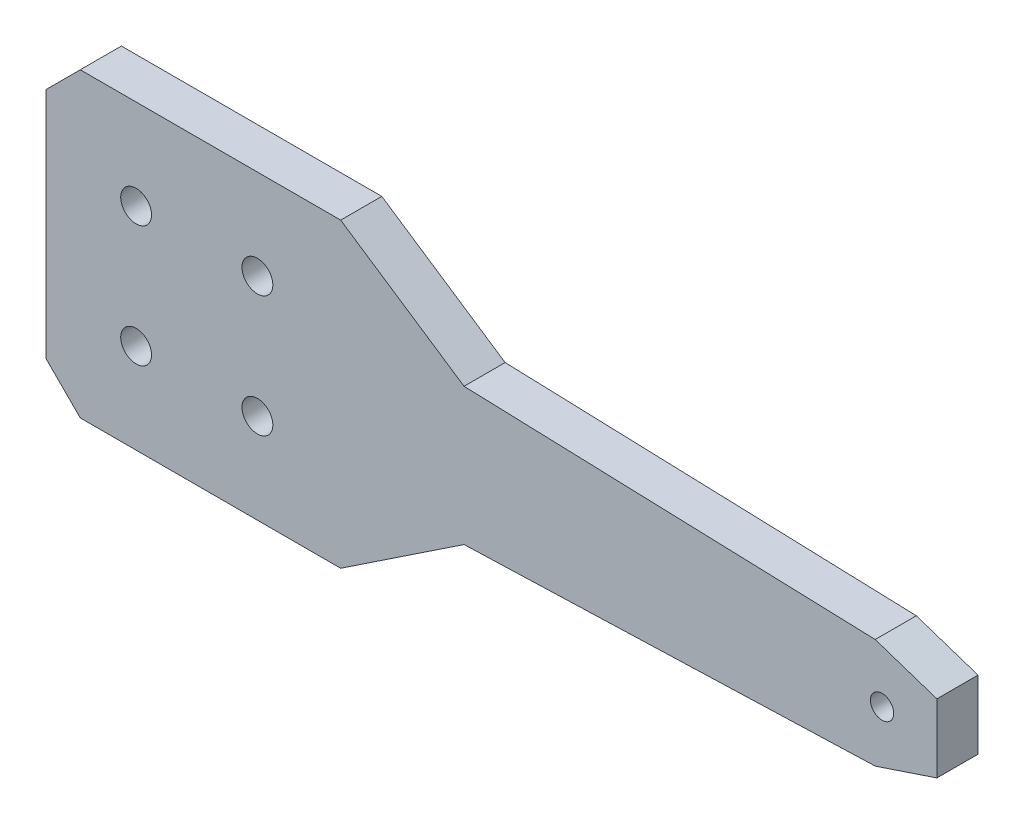
ISO-10303-21;
HEADER;
FILE_DESCRIPTION(('STEP AP214'),'2;1');
FILE_NAME('part.step','',(''),(''),'','','');
FILE_SCHEMA(('AUTOMOTIVE_DESIGN { 1 0 10303 214 1 1 1 1 }'));
ENDSEC;
DATA;
#1=APPLICATION_CONTEXT('core data for automotive mechanical design processes');
#2=APPLICATION_PROTOCOL_DEFINITION('international standard','automotive_design',2000,#1);
#3=PRODUCT_CONTEXT('',#1,'mechanical');
#4=PRODUCT('Part','Part','',(#3));
#5=PRODUCT_RELATED_PRODUCT_CATEGORY('part','',(#4));
#6=PRODUCT_DEFINITION_FORMATION('','',#4);
#7=PRODUCT_DEFINITION_CONTEXT('part definition',#1,'design');
#8=PRODUCT_DEFINITION('design','',#6,#7);
#9=PRODUCT_DEFINITION_SHAPE('','',#8);
#10=(LENGTH_UNIT() NAMED_UNIT(*) SI_UNIT(.MILLI.,.METRE.));
#11=(NAMED_UNIT(*) PLANE_ANGLE_UNIT() SI_UNIT($,.RADIAN.));
#12=(NAMED_UNIT(*) SI_UNIT($,.STERADIAN.) SOLID_ANGLE_UNIT());
#13=UNCERTAINTY_MEASURE_WITH_UNIT(LENGTH_MEASURE(1.E-05),#10,'distance_accuracy_value','');
#14=(GEOMETRIC_REPRESENTATION_CONTEXT(3) GLOBAL_UNCERTAINTY_ASSIGNED_CONTEXT((#13)) GLOBAL_UNIT_ASSIGNED_CONTEXT((#10,
#11,#12)) REPRESENTATION_CONTEXT('',''));
#15=CARTESIAN_POINT('',(0.,0.,0.));
#16=DIRECTION('',(0.,0.,1.));
#17=DIRECTION('',(1.,0.,0.));
#18=AXIS2_PLACEMENT_3D('',#15,#16,#17);
#19=CARTESIAN_POINT('',(0.,0.,6.));
#20=DIRECTION('',(0.,0.,1.));
#21=DIRECTION('',(1.,0.,0.));
#22=AXIS2_PLACEMENT_3D('',#19,#20,#21);
#23=PLANE('',#22);
#24=CARTESIAN_POINT('',(8.85,8.85,6.));
#25=DIRECTION('',(0.,0.,1.));
#26=DIRECTION('',(1.,0.,0.));
#27=AXIS2_PLACEMENT_3D('',#24,#25,#26);
#28=CIRCLE('',#27,2.25);
#29=CARTESIAN_POINT('',(11.1,8.85,6.));
#30=VERTEX_POINT('',#29);
#31=EDGE_CURVE('E299',#30,#30,#28,.T.);
#32=ORIENTED_EDGE('',*,*,#31,.F.);
#33=EDGE_LOOP('',(#32));
#34=FACE_BOUND('',#33,.T.);
#35=CARTESIAN_POINT('',(-8.85,8.85,6.));
#36=DIRECTION('',(0.,0.,1.));
#37=DIRECTION('',(1.,0.,0.));
#38=AXIS2_PLACEMENT_3D('',#35,#36,#37);
#39=CIRCLE('',#38,2.25);
#40=CARTESIAN_POINT('',(-6.6,8.85,6.));
#41=VERTEX_POINT('',#40);
#42=EDGE_CURVE('E311',#41,#41,#39,.T.);
#43=ORIENTED_EDGE('',*,*,#42,.F.);
#44=EDGE_LOOP('',(#43));
#45=FACE_BOUND('',#44,.T.);
#46=DIRECTION('',(0.,-1.,0.));
#47=VECTOR('',#46,1.);
#48=CARTESIAN_POINT('',(-22.,17.,6.));
#49=LINE('',#48,#47);
#50=CARTESIAN_POINT('',(-22.,17.,6.));
#51=VERTEX_POINT('',#50);
#52=CARTESIAN_POINT('',(-22.,-17.,6.));
#53=VERTEX_POINT('',#52);
#54=EDGE_CURVE('E181',#51,#53,#49,.T.);
#55=ORIENTED_EDGE('',*,*,#54,.T.);
#56=DIRECTION('',(0.707106781186547,-0.707106781186547,0.));
#57=VECTOR('',#56,1.);
#58=CARTESIAN_POINT('',(-22.,-17.,6.));
#59=LINE('',#58,#57);
#60=CARTESIAN_POINT('',(-17.,-22.,6.));
#61=VERTEX_POINT('',#60);
#62=EDGE_CURVE('E109',#53,#61,#59,.T.);
#63=ORIENTED_EDGE('',*,*,#62,.T.);
#64=DIRECTION('',(1.,0.,0.));
#65=VECTOR('',#64,1.);
#66=CARTESIAN_POINT('',(-17.,-22.,6.));
#67=LINE('',#66,#65);
#68=CARTESIAN_POINT('',(21.,-22.,6.));
#69=VERTEX_POINT('',#68);
#70=EDGE_CURVE('E208',#61,#69,#67,.T.);
#71=ORIENTED_EDGE('',*,*,#70,.T.);
#72=DIRECTION('',(0.832050294337844,0.554700196225229,0.));
#73=VECTOR('',#72,1.);
#74=CARTESIAN_POINT('',(21.,-22.,6.));
#75=LINE('',#74,#73);
#76=CARTESIAN_POINT('',(39.,-10.,6.));
#77=VERTEX_POINT('',#76);
#78=EDGE_CURVE('E227',#69,#77,#75,.T.);
#79=ORIENTED_EDGE('',*,*,#78,.T.);
#80=DIRECTION('',(0.999444906979154,0.0333148302326385,0.));
#81=VECTOR('',#80,1.);
#82=CARTESIAN_POINT('',(39.,-10.,6.));
#83=LINE('',#82,#81);
#84=CARTESIAN_POINT('',(99.,-8.,6.));
#85=VERTEX_POINT('',#84);
#86=EDGE_CURVE('E224',#77,#85,#83,.T.);
#87=ORIENTED_EDGE('',*,*,#86,.T.);
#88=DIRECTION('',(0.948683298050514,0.316227766016838,0.));
#89=VECTOR('',#88,1.);
#90=CARTESIAN_POINT('',(99.,-8.,6.));
#91=LINE('',#90,#89);
#92=CARTESIAN_POINT('',(108.,-5.,6.));
#93=VERTEX_POINT('',#92);
#94=EDGE_CURVE('E226',#85,#93,#91,.T.);
#95=ORIENTED_EDGE('',*,*,#94,.T.);
#96=DIRECTION('',(0.,1.,0.));
#97=VECTOR('',#96,1.);
#98=CARTESIAN_POINT('',(108.,-5.,6.));
#99=LINE('',#98,#97);
#100=CARTESIAN_POINT('',(108.,5.,6.));
#101=VERTEX_POINT('',#100);
#102=EDGE_CURVE('E229',#93,#101,#99,.T.);
#103=ORIENTED_EDGE('',*,*,#102,.T.);
#104=DIRECTION('',(-0.948683298050514,0.316227766016838,0.));
#105=VECTOR('',#104,1.);
#106=CARTESIAN_POINT('',(108.,5.,6.));
#107=LINE('',#106,#105);
#108=CARTESIAN_POINT('',(99.,8.,6.));
#109=VERTEX_POINT('',#108);
#110=EDGE_CURVE('E235',#101,#109,#107,.T.);
#111=ORIENTED_EDGE('',*,*,#110,.T.);
#112=DIRECTION('',(-0.999444906979154,0.0333148302326385,0.));
#113=VECTOR('',#112,1.);
#114=CARTESIAN_POINT('',(99.,8.,6.));
#115=LINE('',#114,#113);
#116=CARTESIAN_POINT('',(39.,10.,6.));
#117=VERTEX_POINT('',#116);
#118=EDGE_CURVE('E140',#109,#117,#115,.T.);
#119=ORIENTED_EDGE('',*,*,#118,.T.);
#120=DIRECTION('',(-0.832050294337844,0.554700196225229,0.));
#121=VECTOR('',#120,1.);
#122=CARTESIAN_POINT('',(39.,10.,6.));
#123=LINE('',#122,#121);
#124=CARTESIAN_POINT('',(21.,22.,6.));
#125=VERTEX_POINT('',#124);
#126=EDGE_CURVE('E134',#117,#125,#123,.T.);
#127=ORIENTED_EDGE('',*,*,#126,.T.);
#128=DIRECTION('',(-1.,0.,0.));
#129=VECTOR('',#128,1.);
#130=CARTESIAN_POINT('',(21.,22.,6.));
#131=LINE('',#130,#129);
#132=CARTESIAN_POINT('',(-17.,22.,6.));
#133=VERTEX_POINT('',#132);
#134=EDGE_CURVE('E138',#125,#133,#131,.T.);
#135=ORIENTED_EDGE('',*,*,#134,.T.);
#136=DIRECTION('',(-0.707106781186547,-0.707106781186547,0.));
#137=VECTOR('',#136,1.);
#138=CARTESIAN_POINT('',(-17.,22.,6.));
#139=LINE('',#138,#137);
#140=EDGE_CURVE('E54',#133,#51,#139,.T.);
#141=ORIENTED_EDGE('',*,*,#140,.T.);
#142=EDGE_LOOP('',(#55,#63,#71,#79,#87,#95,#103,#111,#119,#127,#135,#141));
#143=FACE_BOUND('',#142,.T.);
#144=CARTESIAN_POINT('',(-8.85,-8.85,6.));
#145=DIRECTION('',(0.,0.,1.));
#146=DIRECTION('',(1.,0.,0.));
#147=AXIS2_PLACEMENT_3D('',#144,#145,#146);
#148=CIRCLE('',#147,2.25);
#149=CARTESIAN_POINT('',(-6.6,-8.85,6.));
#150=VERTEX_POINT('',#149);
#151=EDGE_CURVE('E162',#150,#150,#148,.T.);
#152=ORIENTED_EDGE('',*,*,#151,.F.);
#153=EDGE_LOOP('',(#152));
#154=FACE_BOUND('',#153,.T.);
#155=CARTESIAN_POINT('',(8.85,-8.85,6.));
#156=DIRECTION('',(0.,0.,1.));
#157=DIRECTION('',(1.,0.,0.));
#158=AXIS2_PLACEMENT_3D('',#155,#156,#157);
#159=CIRCLE('',#158,2.25);
#160=CARTESIAN_POINT('',(11.1,-8.85,6.));
#161=VERTEX_POINT('',#160);
#162=EDGE_CURVE('E305',#161,#161,#159,.T.);
#163=ORIENTED_EDGE('',*,*,#162,.F.);
#164=EDGE_LOOP('',(#163));
#165=FACE_BOUND('',#164,.T.);
#166=CARTESIAN_POINT('',(100.,0.,6.));
#167=DIRECTION('',(0.,0.,1.));
#168=DIRECTION('',(1.,0.,0.));
#169=AXIS2_PLACEMENT_3D('',#166,#167,#168);
#170=CIRCLE('',#169,1.69999999999999);
#171=CARTESIAN_POINT('',(101.7,0.,6.));
#172=VERTEX_POINT('',#171);
#173=EDGE_CURVE('E290',#172,#172,#170,.T.);
#174=ORIENTED_EDGE('',*,*,#173,.F.);
#175=EDGE_LOOP('',(#174));
#176=FACE_BOUND('',#175,.T.);
#177=ADVANCED_FACE('F37',(#34,#45,#143,#154,#165,#176),#23,.T.);
#178=CARTESIAN_POINT('',(0.,0.,0.));
#179=DIRECTION('',(0.,0.,1.));
#180=DIRECTION('',(1.,0.,0.));
#181=AXIS2_PLACEMENT_3D('',#178,#179,#180);
#182=PLANE('',#181);
#183=DIRECTION('',(0.,-1.,0.));
#184=VECTOR('',#183,1.);
#185=CARTESIAN_POINT('',(-22.,17.,0.));
#186=LINE('',#185,#184);
#187=CARTESIAN_POINT('',(-22.,17.,0.));
#188=VERTEX_POINT('',#187);
#189=CARTESIAN_POINT('',(-22.,-17.,0.));
#190=VERTEX_POINT('',#189);
#191=EDGE_CURVE('E158',#188,#190,#186,.T.);
#192=ORIENTED_EDGE('',*,*,#191,.F.);
#193=DIRECTION('',(-0.707106781186547,-0.707106781186547,0.));
#194=VECTOR('',#193,1.);
#195=CARTESIAN_POINT('',(-17.,22.,0.));
#196=LINE('',#195,#194);
#197=CARTESIAN_POINT('',(-17.,22.,0.));
#198=VERTEX_POINT('',#197);
#199=EDGE_CURVE('E101',#198,#188,#196,.T.);
#200=ORIENTED_EDGE('',*,*,#199,.F.);
#201=DIRECTION('',(-1.,0.,0.));
#202=VECTOR('',#201,1.);
#203=CARTESIAN_POINT('',(21.,22.,0.));
#204=LINE('',#203,#202);
#205=CARTESIAN_POINT('',(21.,22.,0.));
#206=VERTEX_POINT('',#205);
#207=EDGE_CURVE('E95',#206,#198,#204,.T.);
#208=ORIENTED_EDGE('',*,*,#207,.F.);
#209=DIRECTION('',(-0.832050294337844,0.554700196225229,0.));
#210=VECTOR('',#209,1.);
#211=CARTESIAN_POINT('',(39.,10.,0.));
#212=LINE('',#211,#210);
#213=CARTESIAN_POINT('',(39.,10.,0.));
#214=VERTEX_POINT('',#213);
#215=EDGE_CURVE('E148',#214,#206,#212,.T.);
#216=ORIENTED_EDGE('',*,*,#215,.F.);
#217=DIRECTION('',(-0.999444906979154,0.0333148302326385,0.));
#218=VECTOR('',#217,1.);
#219=CARTESIAN_POINT('',(99.,8.,0.));
#220=LINE('',#219,#218);
#221=CARTESIAN_POINT('',(99.,8.,0.));
#222=VERTEX_POINT('',#221);
#223=EDGE_CURVE('E176',#222,#214,#220,.T.);
#224=ORIENTED_EDGE('',*,*,#223,.F.);
#225=DIRECTION('',(-0.948683298050514,0.316227766016838,0.));
#226=VECTOR('',#225,1.);
#227=CARTESIAN_POINT('',(108.,5.,0.));
#228=LINE('',#227,#226);
#229=CARTESIAN_POINT('',(108.,5.,0.));
#230=VERTEX_POINT('',#229);
#231=EDGE_CURVE('E174',#230,#222,#228,.T.);
#232=ORIENTED_EDGE('',*,*,#231,.F.);
#233=DIRECTION('',(0.,1.,0.));
#234=VECTOR('',#233,1.);
#235=CARTESIAN_POINT('',(108.,-5.,0.));
#236=LINE('',#235,#234);
#237=CARTESIAN_POINT('',(108.,-5.,0.));
#238=VERTEX_POINT('',#237);
#239=EDGE_CURVE('E172',#238,#230,#236,.T.);
#240=ORIENTED_EDGE('',*,*,#239,.F.);
#241=DIRECTION('',(0.948683298050514,0.316227766016838,0.));
#242=VECTOR('',#241,1.);
#243=CARTESIAN_POINT('',(99.,-8.,0.));
#244=LINE('',#243,#242);
#245=CARTESIAN_POINT('',(99.,-8.,0.));
#246=VERTEX_POINT('',#245);
#247=EDGE_CURVE('E170',#246,#238,#244,.T.);
#248=ORIENTED_EDGE('',*,*,#247,.F.);
#249=DIRECTION('',(0.999444906979154,0.0333148302326385,0.));
#250=VECTOR('',#249,1.);
#251=CARTESIAN_POINT('',(39.,-10.,0.));
#252=LINE('',#251,#250);
#253=CARTESIAN_POINT('',(39.,-10.,0.));
#254=VERTEX_POINT('',#253);
#255=EDGE_CURVE('E168',#254,#246,#252,.T.);
#256=ORIENTED_EDGE('',*,*,#255,.F.);
#257=DIRECTION('',(0.832050294337844,0.554700196225229,0.));
#258=VECTOR('',#257,1.);
#259=CARTESIAN_POINT('',(21.,-22.,0.));
#260=LINE('',#259,#258);
#261=CARTESIAN_POINT('',(21.,-22.,0.));
#262=VERTEX_POINT('',#261);
#263=EDGE_CURVE('E166',#262,#254,#260,.T.);
#264=ORIENTED_EDGE('',*,*,#263,.F.);
#265=DIRECTION('',(1.,0.,0.));
#266=VECTOR('',#265,1.);
#267=CARTESIAN_POINT('',(-17.,-22.,0.));
#268=LINE('',#267,#266);
#269=CARTESIAN_POINT('',(-17.,-22.,0.));
#270=VERTEX_POINT('',#269);
#271=EDGE_CURVE('E164',#270,#262,#268,.T.);
#272=ORIENTED_EDGE('',*,*,#271,.F.);
#273=DIRECTION('',(0.707106781186547,-0.707106781186547,0.));
#274=VECTOR('',#273,1.);
#275=CARTESIAN_POINT('',(-22.,-17.,0.));
#276=LINE('',#275,#274);
#277=EDGE_CURVE('E161',#190,#270,#276,.T.);
#278=ORIENTED_EDGE('',*,*,#277,.F.);
#279=EDGE_LOOP('',(#192,#200,#208,#216,#224,#232,#240,#248,#256,#264,#272,#278));
#280=FACE_BOUND('',#279,.T.);
#281=CARTESIAN_POINT('',(-8.85,-8.85,0.));
#282=DIRECTION('',(0.,0.,1.));
#283=DIRECTION('',(1.,0.,0.));
#284=AXIS2_PLACEMENT_3D('',#281,#282,#283);
#285=CIRCLE('',#284,2.25);
#286=CARTESIAN_POINT('',(-6.6,-8.85,0.));
#287=VERTEX_POINT('',#286);
#288=EDGE_CURVE('E314',#287,#287,#285,.T.);
#289=ORIENTED_EDGE('',*,*,#288,.T.);
#290=EDGE_LOOP('',(#289));
#291=FACE_BOUND('',#290,.T.);
#292=CARTESIAN_POINT('',(-8.85,8.85,0.));
#293=DIRECTION('',(0.,0.,1.));
#294=DIRECTION('',(1.,0.,0.));
#295=AXIS2_PLACEMENT_3D('',#292,#293,#294);
#296=CIRCLE('',#295,2.25);
#297=CARTESIAN_POINT('',(-6.6,8.85,0.));
#298=VERTEX_POINT('',#297);
#299=EDGE_CURVE('E308',#298,#298,#296,.T.);
#300=ORIENTED_EDGE('',*,*,#299,.T.);
#301=EDGE_LOOP('',(#300));
#302=FACE_BOUND('',#301,.T.);
#303=CARTESIAN_POINT('',(8.85,-8.85,0.));
#304=DIRECTION('',(0.,0.,1.));
#305=DIRECTION('',(1.,0.,0.));
#306=AXIS2_PLACEMENT_3D('',#303,#304,#305);
#307=CIRCLE('',#306,2.25);
#308=CARTESIAN_POINT('',(11.1,-8.85,0.));
#309=VERTEX_POINT('',#308);
#310=EDGE_CURVE('E302',#309,#309,#307,.T.);
#311=ORIENTED_EDGE('',*,*,#310,.T.);
#312=EDGE_LOOP('',(#311));
#313=FACE_BOUND('',#312,.T.);
#314=CARTESIAN_POINT('',(8.85,8.85,0.));
#315=DIRECTION('',(0.,0.,1.));
#316=DIRECTION('',(1.,0.,0.));
#317=AXIS2_PLACEMENT_3D('',#314,#315,#316);
#318=CIRCLE('',#317,2.25);
#319=CARTESIAN_POINT('',(11.1,8.85,0.));
#320=VERTEX_POINT('',#319);
#321=EDGE_CURVE('E296',#320,#320,#318,.T.);
#322=ORIENTED_EDGE('',*,*,#321,.T.);
#323=EDGE_LOOP('',(#322));
#324=FACE_BOUND('',#323,.T.);
#325=CARTESIAN_POINT('',(100.,0.,0.));
#326=DIRECTION('',(0.,0.,1.));
#327=DIRECTION('',(1.,0.,0.));
#328=AXIS2_PLACEMENT_3D('',#325,#326,#327);
#329=CIRCLE('',#328,1.69999999999999);
#330=CARTESIAN_POINT('',(101.7,0.,0.));
#331=VERTEX_POINT('',#330);
#332=EDGE_CURVE('E293',#331,#331,#329,.T.);
#333=ORIENTED_EDGE('',*,*,#332,.T.);
#334=EDGE_LOOP('',(#333));
#335=FACE_BOUND('',#334,.T.);
#336=ADVANCED_FACE('F212',(#280,#291,#302,#313,#324,#335),#182,.F.);
#337=CARTESIAN_POINT('',(-22.,17.,6.));
#338=DIRECTION('',(1.,0.,0.));
#339=DIRECTION('',(0.,0.,-1.));
#340=AXIS2_PLACEMENT_3D('',#337,#338,#339);
#341=PLANE('',#340);
#342=ORIENTED_EDGE('',*,*,#191,.T.);
#343=DIRECTION('',(0.,0.,-1.));
#344=VECTOR('',#343,1.);
#345=CARTESIAN_POINT('',(-22.,-17.,6.));
#346=LINE('',#345,#344);
#347=EDGE_CURVE('E11',#53,#190,#346,.T.);
#348=ORIENTED_EDGE('',*,*,#347,.F.);
#349=ORIENTED_EDGE('',*,*,#54,.F.);
#350=DIRECTION('',(0.,0.,-1.));
#351=VECTOR('',#350,1.);
#352=CARTESIAN_POINT('',(-22.,17.,6.));
#353=LINE('',#352,#351);
#354=EDGE_CURVE('E154',#51,#188,#353,.T.);
#355=ORIENTED_EDGE('',*,*,#354,.T.);
#356=EDGE_LOOP('',(#342,#348,#349,#355));
#357=FACE_BOUND('',#356,.T.);
#358=ADVANCED_FACE('F39',(#357),#341,.F.);
#359=CARTESIAN_POINT('',(-22.,-17.,6.));
#360=DIRECTION('',(0.707106781186548,0.707106781186548,0.));
#361=DIRECTION('',(-0.707106781186548,0.707106781186548,0.));
#362=AXIS2_PLACEMENT_3D('',#359,#360,#361);
#363=PLANE('',#362);
#364=ORIENTED_EDGE('',*,*,#277,.T.);
#365=DIRECTION('',(0.,0.,-1.));
#366=VECTOR('',#365,1.);
#367=CARTESIAN_POINT('',(-17.,-22.,6.));
#368=LINE('',#367,#366);
#369=EDGE_CURVE('E46',#61,#270,#368,.T.);
#370=ORIENTED_EDGE('',*,*,#369,.F.);
#371=ORIENTED_EDGE('',*,*,#62,.F.);
#372=ORIENTED_EDGE('',*,*,#347,.T.);
#373=EDGE_LOOP('',(#364,#370,#371,#372));
#374=FACE_BOUND('',#373,.T.);
#375=ADVANCED_FACE('F433',(#374),#363,.F.);
#376=CARTESIAN_POINT('',(-17.,-22.,6.));
#377=DIRECTION('',(0.,1.,0.));
#378=DIRECTION('',(0.,0.,1.));
#379=AXIS2_PLACEMENT_3D('',#376,#377,#378);
#380=PLANE('',#379);
#381=ORIENTED_EDGE('',*,*,#271,.T.);
#382=DIRECTION('',(0.,0.,-1.));
#383=VECTOR('',#382,1.);
#384=CARTESIAN_POINT('',(21.,-22.,6.));
#385=LINE('',#384,#383);
#386=EDGE_CURVE('E200',#69,#262,#385,.T.);
#387=ORIENTED_EDGE('',*,*,#386,.F.);
#388=ORIENTED_EDGE('',*,*,#70,.F.);
#389=ORIENTED_EDGE('',*,*,#369,.T.);
#390=EDGE_LOOP('',(#381,#387,#388,#389));
#391=FACE_BOUND('',#390,.T.);
#392=ADVANCED_FACE('F206',(#391),#380,.F.);
#393=CARTESIAN_POINT('',(21.,-22.,6.));
#394=DIRECTION('',(-0.554700196225229,0.832050294337844,0.));
#395=DIRECTION('',(-0.832050294337844,-0.554700196225229,0.));
#396=AXIS2_PLACEMENT_3D('',#393,#394,#395);
#397=PLANE('',#396);
#398=ORIENTED_EDGE('',*,*,#263,.T.);
#399=DIRECTION('',(0.,0.,-1.));
#400=VECTOR('',#399,1.);
#401=CARTESIAN_POINT('',(39.,-10.,6.));
#402=LINE('',#401,#400);
#403=EDGE_CURVE('E197',#77,#254,#402,.T.);
#404=ORIENTED_EDGE('',*,*,#403,.F.);
#405=ORIENTED_EDGE('',*,*,#78,.F.);
#406=ORIENTED_EDGE('',*,*,#386,.T.);
#407=EDGE_LOOP('',(#398,#404,#405,#406));
#408=FACE_BOUND('',#407,.T.);
#409=ADVANCED_FACE('F218',(#408),#397,.F.);
#410=CARTESIAN_POINT('',(39.,-10.,6.));
#411=DIRECTION('',(-0.0333148302326385,0.999444906979154,0.));
#412=DIRECTION('',(-0.999444906979154,-0.0333148302326385,0.));
#413=AXIS2_PLACEMENT_3D('',#410,#411,#412);
#414=PLANE('',#413);
#415=ORIENTED_EDGE('',*,*,#255,.T.);
#416=DIRECTION('',(0.,0.,-1.));
#417=VECTOR('',#416,1.);
#418=CARTESIAN_POINT('',(99.,-8.,6.));
#419=LINE('',#418,#417);
#420=EDGE_CURVE('E194',#85,#246,#419,.T.);
#421=ORIENTED_EDGE('',*,*,#420,.F.);
#422=ORIENTED_EDGE('',*,*,#86,.F.);
#423=ORIENTED_EDGE('',*,*,#403,.T.);
#424=EDGE_LOOP('',(#415,#421,#422,#423));
#425=FACE_BOUND('',#424,.T.);
#426=ADVANCED_FACE('F222',(#425),#414,.F.);
#427=CARTESIAN_POINT('',(99.,-8.,6.));
#428=DIRECTION('',(-0.316227766016838,0.948683298050514,0.));
#429=DIRECTION('',(-0.948683298050514,-0.316227766016838,0.));
#430=AXIS2_PLACEMENT_3D('',#427,#428,#429);
#431=PLANE('',#430);
#432=ORIENTED_EDGE('',*,*,#247,.T.);
#433=DIRECTION('',(0.,0.,-1.));
#434=VECTOR('',#433,1.);
#435=CARTESIAN_POINT('',(108.,-5.,6.));
#436=LINE('',#435,#434);
#437=EDGE_CURVE('E191',#93,#238,#436,.T.);
#438=ORIENTED_EDGE('',*,*,#437,.F.);
#439=ORIENTED_EDGE('',*,*,#94,.F.);
#440=ORIENTED_EDGE('',*,*,#420,.T.);
#441=EDGE_LOOP('',(#432,#438,#439,#440));
#442=FACE_BOUND('',#441,.T.);
#443=ADVANCED_FACE('F398',(#442),#431,.F.);
#444=CARTESIAN_POINT('',(108.,-5.,6.));
#445=DIRECTION('',(-1.,0.,0.));
#446=DIRECTION('',(0.,0.,1.));
#447=AXIS2_PLACEMENT_3D('',#444,#445,#446);
#448=PLANE('',#447);
#449=ORIENTED_EDGE('',*,*,#239,.T.);
#450=DIRECTION('',(0.,0.,-1.));
#451=VECTOR('',#450,1.);
#452=CARTESIAN_POINT('',(108.,5.,6.));
#453=LINE('',#452,#451);
#454=EDGE_CURVE('E188',#101,#230,#453,.T.);
#455=ORIENTED_EDGE('',*,*,#454,.F.);
#456=ORIENTED_EDGE('',*,*,#102,.F.);
#457=ORIENTED_EDGE('',*,*,#437,.T.);
#458=EDGE_LOOP('',(#449,#455,#456,#457));
#459=FACE_BOUND('',#458,.T.);
#460=ADVANCED_FACE('F389',(#459),#448,.F.);
#461=CARTESIAN_POINT('',(108.,5.,6.));
#462=DIRECTION('',(-0.316227766016838,-0.948683298050514,0.));
#463=DIRECTION('',(0.948683298050514,-0.316227766016838,0.));
#464=AXIS2_PLACEMENT_3D('',#461,#462,#463);
#465=PLANE('',#464);
#466=ORIENTED_EDGE('',*,*,#231,.T.);
#467=DIRECTION('',(0.,0.,-1.));
#468=VECTOR('',#467,1.);
#469=CARTESIAN_POINT('',(99.,8.,6.));
#470=LINE('',#469,#468);
#471=EDGE_CURVE('E185',#109,#222,#470,.T.);
#472=ORIENTED_EDGE('',*,*,#471,.F.);
#473=ORIENTED_EDGE('',*,*,#110,.F.);
#474=ORIENTED_EDGE('',*,*,#454,.T.);
#475=EDGE_LOOP('',(#466,#472,#473,#474));
#476=FACE_BOUND('',#475,.T.);
#477=ADVANCED_FACE('F241',(#476),#465,.F.);
#478=CARTESIAN_POINT('',(99.,8.,6.));
#479=DIRECTION('',(-0.0333148302326385,-0.999444906979154,0.));
#480=DIRECTION('',(0.999444906979154,-0.0333148302326385,0.));
#481=AXIS2_PLACEMENT_3D('',#478,#479,#480);
#482=PLANE('',#481);
#483=ORIENTED_EDGE('',*,*,#223,.T.);
#484=DIRECTION('',(0.,0.,-1.));
#485=VECTOR('',#484,1.);
#486=CARTESIAN_POINT('',(39.,10.,6.));
#487=LINE('',#486,#485);
#488=EDGE_CURVE('E149',#117,#214,#487,.T.);
#489=ORIENTED_EDGE('',*,*,#488,.F.);
#490=ORIENTED_EDGE('',*,*,#118,.F.);
#491=ORIENTED_EDGE('',*,*,#471,.T.);
#492=EDGE_LOOP('',(#483,#489,#490,#491));
#493=FACE_BOUND('',#492,.T.);
#494=ADVANCED_FACE('F245',(#493),#482,.F.);
#495=CARTESIAN_POINT('',(39.,10.,6.));
#496=DIRECTION('',(-0.554700196225229,-0.832050294337844,0.));
#497=DIRECTION('',(0.832050294337844,-0.554700196225229,0.));
#498=AXIS2_PLACEMENT_3D('',#495,#496,#497);
#499=PLANE('',#498);
#500=ORIENTED_EDGE('',*,*,#215,.T.);
#501=DIRECTION('',(0.,0.,-1.));
#502=VECTOR('',#501,1.);
#503=CARTESIAN_POINT('',(21.,22.,6.));
#504=LINE('',#503,#502);
#505=EDGE_CURVE('E145',#125,#206,#504,.T.);
#506=ORIENTED_EDGE('',*,*,#505,.F.);
#507=ORIENTED_EDGE('',*,*,#126,.F.);
#508=ORIENTED_EDGE('',*,*,#488,.T.);
#509=EDGE_LOOP('',(#500,#506,#507,#508));
#510=FACE_BOUND('',#509,.T.);
#511=ADVANCED_FACE('F146',(#510),#499,.F.);
#512=CARTESIAN_POINT('',(21.,22.,6.));
#513=DIRECTION('',(0.,-1.,0.));
#514=DIRECTION('',(0.,0.,-1.));
#515=AXIS2_PLACEMENT_3D('',#512,#513,#514);
#516=PLANE('',#515);
#517=ORIENTED_EDGE('',*,*,#207,.T.);
#518=DIRECTION('',(0.,0.,-1.));
#519=VECTOR('',#518,1.);
#520=CARTESIAN_POINT('',(-17.,22.,6.));
#521=LINE('',#520,#519);
#522=EDGE_CURVE('E150',#133,#198,#521,.T.);
#523=ORIENTED_EDGE('',*,*,#522,.F.);
#524=ORIENTED_EDGE('',*,*,#134,.F.);
#525=ORIENTED_EDGE('',*,*,#505,.T.);
#526=EDGE_LOOP('',(#517,#523,#524,#525));
#527=FACE_BOUND('',#526,.T.);
#528=ADVANCED_FACE('F152',(#527),#516,.F.);
#529=CARTESIAN_POINT('',(-17.,22.,6.));
#530=DIRECTION('',(0.707106781186548,-0.707106781186548,0.));
#531=DIRECTION('',(0.707106781186548,0.707106781186548,0.));
#532=AXIS2_PLACEMENT_3D('',#529,#530,#531);
#533=PLANE('',#532);
#534=ORIENTED_EDGE('',*,*,#199,.T.);
#535=ORIENTED_EDGE('',*,*,#354,.F.);
#536=ORIENTED_EDGE('',*,*,#140,.F.);
#537=ORIENTED_EDGE('',*,*,#522,.T.);
#538=EDGE_LOOP('',(#534,#535,#536,#537));
#539=FACE_BOUND('',#538,.T.);
#540=ADVANCED_FACE('F249',(#539),#533,.F.);
#541=CARTESIAN_POINT('',(-8.85,-8.85,6.));
#542=DIRECTION('',(0.,0.,-1.));
#543=DIRECTION('',(-1.,0.,0.));
#544=AXIS2_PLACEMENT_3D('',#541,#542,#543);
#545=CYLINDRICAL_SURFACE('',#544,2.25);
#546=ORIENTED_EDGE('',*,*,#151,.T.);
#547=EDGE_LOOP('',(#546));
#548=FACE_BOUND('',#547,.T.);
#549=ORIENTED_EDGE('',*,*,#288,.F.);
#550=EDGE_LOOP('',(#549));
#551=FACE_BOUND('',#550,.T.);
#552=ADVANCED_FACE('F251',(#548,#551),#545,.F.);
#553=CARTESIAN_POINT('',(-8.85,8.85,6.));
#554=DIRECTION('',(0.,0.,-1.));
#555=DIRECTION('',(-1.,0.,0.));
#556=AXIS2_PLACEMENT_3D('',#553,#554,#555);
#557=CYLINDRICAL_SURFACE('',#556,2.25);
#558=ORIENTED_EDGE('',*,*,#42,.T.);
#559=EDGE_LOOP('',(#558));
#560=FACE_BOUND('',#559,.T.);
#561=ORIENTED_EDGE('',*,*,#299,.F.);
#562=EDGE_LOOP('',(#561));
#563=FACE_BOUND('',#562,.T.);
#564=ADVANCED_FACE('F257',(#560,#563),#557,.F.);
#565=CARTESIAN_POINT('',(8.85,-8.85,6.));
#566=DIRECTION('',(0.,0.,-1.));
#567=DIRECTION('',(-1.,0.,0.));
#568=AXIS2_PLACEMENT_3D('',#565,#566,#567);
#569=CYLINDRICAL_SURFACE('',#568,2.25);
#570=ORIENTED_EDGE('',*,*,#162,.T.);
#571=EDGE_LOOP('',(#570));
#572=FACE_BOUND('',#571,.T.);
#573=ORIENTED_EDGE('',*,*,#310,.F.);
#574=EDGE_LOOP('',(#573));
#575=FACE_BOUND('',#574,.T.);
#576=ADVANCED_FACE('F273',(#572,#575),#569,.F.);
#577=CARTESIAN_POINT('',(8.85,8.85,6.));
#578=DIRECTION('',(0.,0.,-1.));
#579=DIRECTION('',(-1.,0.,0.));
#580=AXIS2_PLACEMENT_3D('',#577,#578,#579);
#581=CYLINDRICAL_SURFACE('',#580,2.25);
#582=ORIENTED_EDGE('',*,*,#31,.T.);
#583=EDGE_LOOP('',(#582));
#584=FACE_BOUND('',#583,.T.);
#585=ORIENTED_EDGE('',*,*,#321,.F.);
#586=EDGE_LOOP('',(#585));
#587=FACE_BOUND('',#586,.T.);
#588=ADVANCED_FACE('F277',(#584,#587),#581,.F.);
#589=CARTESIAN_POINT('',(100.,0.,6.));
#590=DIRECTION('',(0.,0.,-1.));
#591=DIRECTION('',(-1.,0.,0.));
#592=AXIS2_PLACEMENT_3D('',#589,#590,#591);
#593=CYLINDRICAL_SURFACE('',#592,1.69999999999999);
#594=ORIENTED_EDGE('',*,*,#173,.T.);
#595=EDGE_LOOP('',(#594));
#596=FACE_BOUND('',#595,.T.);
#597=ORIENTED_EDGE('',*,*,#332,.F.);
#598=EDGE_LOOP('',(#597));
#599=FACE_BOUND('',#598,.T.);
#600=ADVANCED_FACE('F281',(#596,#599),#593,.F.);
#601=CLOSED_SHELL('',(#177,#336,#358,#375,#392,#409,#426,#443,#460,#477,#494,#511,#528,#540,
#552,#564,#576,#588,#600));
#602=MANIFOLD_SOLID_BREP('B2',#601);
#603=ADVANCED_BREP_SHAPE_REPRESENTATION('',(#18,#602),#14);
#604=SHAPE_DEFINITION_REPRESENTATION(#9,#603);
ENDSEC;
END-ISO-10303-21;
